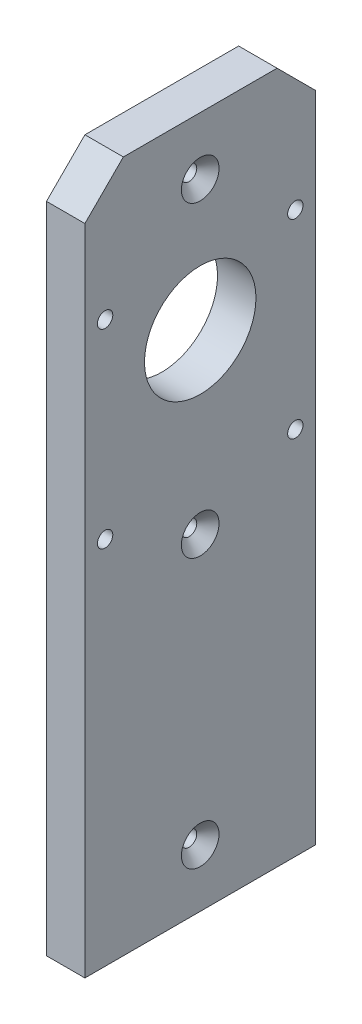
ISO-10303-21;
HEADER;
FILE_DESCRIPTION(('STEP AP214'),'2;1');
FILE_NAME('part.step','',(''),(''),'','','');
FILE_SCHEMA(('AUTOMOTIVE_DESIGN { 1 0 10303 214 1 1 1 1 }'));
ENDSEC;
DATA;
#1=APPLICATION_CONTEXT('core data for automotive mechanical design processes');
#2=APPLICATION_PROTOCOL_DEFINITION('international standard','automotive_design',2000,#1);
#3=PRODUCT_CONTEXT('',#1,'mechanical');
#4=PRODUCT('Part','Part','',(#3));
#5=PRODUCT_RELATED_PRODUCT_CATEGORY('part','',(#4));
#6=PRODUCT_DEFINITION_FORMATION('','',#4);
#7=PRODUCT_DEFINITION_CONTEXT('part definition',#1,'design');
#8=PRODUCT_DEFINITION('design','',#6,#7);
#9=PRODUCT_DEFINITION_SHAPE('','',#8);
#10=(LENGTH_UNIT() NAMED_UNIT(*) SI_UNIT(.MILLI.,.METRE.));
#11=(NAMED_UNIT(*) PLANE_ANGLE_UNIT() SI_UNIT($,.RADIAN.));
#12=(NAMED_UNIT(*) SI_UNIT($,.STERADIAN.) SOLID_ANGLE_UNIT());
#13=UNCERTAINTY_MEASURE_WITH_UNIT(LENGTH_MEASURE(1.E-05),#10,'distance_accuracy_value','');
#14=(GEOMETRIC_REPRESENTATION_CONTEXT(3) GLOBAL_UNCERTAINTY_ASSIGNED_CONTEXT((#13)) GLOBAL_UNIT_ASSIGNED_CONTEXT((#10,
#11,#12)) REPRESENTATION_CONTEXT('',''));
#15=CARTESIAN_POINT('',(0.,0.,0.));
#16=DIRECTION('',(0.,0.,1.));
#17=DIRECTION('',(1.,0.,0.));
#18=AXIS2_PLACEMENT_3D('',#15,#16,#17);
#19=CARTESIAN_POINT('',(10.,50.0624749276451,25.9036398419182));
#20=DIRECTION('',(0.,0.,-1.));
#21=DIRECTION('',(0.,1.,0.));
#22=AXIS2_PLACEMENT_3D('',#19,#20,#21);
#23=PLANE('',#22);
#24=DIRECTION('',(0.,-1.,0.));
#25=VECTOR('',#24,1.);
#26=CARTESIAN_POINT('',(10.,50.0624749276451,25.9036398419182));
#27=LINE('',#26,#25);
#28=CARTESIAN_POINT('',(10.,40.062474927645,25.9036398419182));
#29=VERTEX_POINT('',#28);
#30=CARTESIAN_POINT('',(10.,-129.937525072355,25.9036398419182));
#31=VERTEX_POINT('',#30);
#32=EDGE_CURVE('E86',#29,#31,#27,.T.);
#33=ORIENTED_EDGE('',*,*,#32,.F.);
#34=DIRECTION('',(-1.,0.,0.));
#35=VECTOR('',#34,1.);
#36=CARTESIAN_POINT('',(10.,40.062474927645,25.9036398419182));
#37=LINE('',#36,#35);
#38=CARTESIAN_POINT('',(0.,40.062474927645,25.9036398419182));
#39=VERTEX_POINT('',#38);
#40=EDGE_CURVE('E11',#29,#39,#37,.T.);
#41=ORIENTED_EDGE('',*,*,#40,.T.);
#42=DIRECTION('',(0.,-1.,0.));
#43=VECTOR('',#42,1.);
#44=CARTESIAN_POINT('',(0.,50.0624749276451,25.9036398419182));
#45=LINE('',#44,#43);
#46=CARTESIAN_POINT('',(0.,-129.937525072355,25.9036398419182));
#47=VERTEX_POINT('',#46);
#48=EDGE_CURVE('E105',#39,#47,#45,.T.);
#49=ORIENTED_EDGE('',*,*,#48,.T.);
#50=DIRECTION('',(-1.,0.,0.));
#51=VECTOR('',#50,1.);
#52=CARTESIAN_POINT('',(10.,-129.937525072355,25.9036398419182));
#53=LINE('',#52,#51);
#54=EDGE_CURVE('E99',#31,#47,#53,.T.);
#55=ORIENTED_EDGE('',*,*,#54,.F.);
#56=EDGE_LOOP('',(#33,#41,#49,#55));
#57=FACE_BOUND('',#56,.T.);
#58=ADVANCED_FACE('F33',(#57),#23,.F.);
#59=CARTESIAN_POINT('',(10.,-129.937525072355,25.9036398419182));
#60=DIRECTION('',(0.,1.,0.));
#61=DIRECTION('',(0.,0.,1.));
#62=AXIS2_PLACEMENT_3D('',#59,#60,#61);
#63=PLANE('',#62);
#64=CARTESIAN_POINT('',(5.00000000000001,-129.937525072355,-28.0963601580818));
#65=DIRECTION('',(0.,-1.,0.));
#66=DIRECTION('',(0.,0.,-1.));
#67=AXIS2_PLACEMENT_3D('',#64,#65,#66);
#68=CIRCLE('',#67,1.65);
#69=CARTESIAN_POINT('',(5.00000000000001,-129.937525072355,-29.7463601580818));
#70=VERTEX_POINT('',#69);
#71=EDGE_CURVE('E220',#70,#70,#68,.T.);
#72=ORIENTED_EDGE('',*,*,#71,.F.);
#73=EDGE_LOOP('',(#72));
#74=FACE_BOUND('',#73,.T.);
#75=CARTESIAN_POINT('',(5.,-129.937525072355,19.9036398419183));
#76=DIRECTION('',(0.,-1.,0.));
#77=DIRECTION('',(0.,0.,-1.));
#78=AXIS2_PLACEMENT_3D('',#75,#76,#77);
#79=CIRCLE('',#78,1.65);
#80=CARTESIAN_POINT('',(5.,-129.937525072355,18.2536398419183));
#81=VERTEX_POINT('',#80);
#82=EDGE_CURVE('E214',#81,#81,#79,.T.);
#83=ORIENTED_EDGE('',*,*,#82,.F.);
#84=EDGE_LOOP('',(#83));
#85=FACE_BOUND('',#84,.T.);
#86=DIRECTION('',(0.,0.,-1.));
#87=VECTOR('',#86,1.);
#88=CARTESIAN_POINT('',(0.,-129.937525072355,25.9036398419182));
#89=LINE('',#88,#87);
#90=CARTESIAN_POINT('',(0.,-129.937525072355,-34.0963601580818));
#91=VERTEX_POINT('',#90);
#92=EDGE_CURVE('E191',#47,#91,#89,.T.);
#93=ORIENTED_EDGE('',*,*,#92,.T.);
#94=DIRECTION('',(-1.,0.,0.));
#95=VECTOR('',#94,1.);
#96=CARTESIAN_POINT('',(10.,-129.937525072355,-34.0963601580818));
#97=LINE('',#96,#95);
#98=CARTESIAN_POINT('',(10.,-129.937525072355,-34.0963601580818));
#99=VERTEX_POINT('',#98);
#100=EDGE_CURVE('E101',#99,#91,#97,.T.);
#101=ORIENTED_EDGE('',*,*,#100,.F.);
#102=DIRECTION('',(0.,0.,-1.));
#103=VECTOR('',#102,1.);
#104=CARTESIAN_POINT('',(10.,-129.937525072355,25.9036398419182));
#105=LINE('',#104,#103);
#106=EDGE_CURVE('E89',#31,#99,#105,.T.);
#107=ORIENTED_EDGE('',*,*,#106,.F.);
#108=ORIENTED_EDGE('',*,*,#54,.T.);
#109=EDGE_LOOP('',(#93,#101,#107,#108));
#110=FACE_BOUND('',#109,.T.);
#111=ADVANCED_FACE('F98',(#74,#85,#110),#63,.F.);
#112=CARTESIAN_POINT('',(10.,50.0624749276451,-34.0963601580818));
#113=DIRECTION('',(0.,0.,1.));
#114=DIRECTION('',(0.,-1.,0.));
#115=AXIS2_PLACEMENT_3D('',#112,#113,#114);
#116=PLANE('',#115);
#117=DIRECTION('',(0.,1.,0.));
#118=VECTOR('',#117,1.);
#119=CARTESIAN_POINT('',(0.,50.0624749276451,-34.0963601580818));
#120=LINE('',#119,#118);
#121=CARTESIAN_POINT('',(0.,40.062474927645,-34.0963601580818));
#122=VERTEX_POINT('',#121);
#123=EDGE_CURVE('E189',#91,#122,#120,.T.);
#124=ORIENTED_EDGE('',*,*,#123,.T.);
#125=DIRECTION('',(1.,0.,0.));
#126=VECTOR('',#125,1.);
#127=CARTESIAN_POINT('',(10.,40.062474927645,-34.0963601580818));
#128=LINE('',#127,#126);
#129=CARTESIAN_POINT('',(10.,40.062474927645,-34.0963601580818));
#130=VERTEX_POINT('',#129);
#131=EDGE_CURVE('E56',#122,#130,#128,.T.);
#132=ORIENTED_EDGE('',*,*,#131,.T.);
#133=DIRECTION('',(0.,1.,0.));
#134=VECTOR('',#133,1.);
#135=CARTESIAN_POINT('',(10.,50.0624749276451,-34.0963601580818));
#136=LINE('',#135,#134);
#137=EDGE_CURVE('E102',#99,#130,#136,.T.);
#138=ORIENTED_EDGE('',*,*,#137,.F.);
#139=ORIENTED_EDGE('',*,*,#100,.T.);
#140=EDGE_LOOP('',(#124,#132,#138,#139));
#141=FACE_BOUND('',#140,.T.);
#142=ADVANCED_FACE('F190',(#141),#116,.F.);
#143=CARTESIAN_POINT('',(10.,50.0624749276451,25.9036398419182));
#144=DIRECTION('',(0.,-1.,0.));
#145=DIRECTION('',(0.,0.,-1.));
#146=AXIS2_PLACEMENT_3D('',#143,#144,#145);
#147=PLANE('',#146);
#148=DIRECTION('',(0.,0.,1.));
#149=VECTOR('',#148,1.);
#150=CARTESIAN_POINT('',(10.,50.0624749276451,25.9036398419182));
#151=LINE('',#150,#149);
#152=CARTESIAN_POINT('',(10.,50.0624749276451,-24.0963601580817));
#153=VERTEX_POINT('',#152);
#154=CARTESIAN_POINT('',(10.,50.0624749276451,15.9036398419182));
#155=VERTEX_POINT('',#154);
#156=EDGE_CURVE('E112',#153,#155,#151,.T.);
#157=ORIENTED_EDGE('',*,*,#156,.F.);
#158=DIRECTION('',(-1.,0.,0.));
#159=VECTOR('',#158,1.);
#160=CARTESIAN_POINT('',(10.,50.0624749276451,-24.0963601580817));
#161=LINE('',#160,#159);
#162=CARTESIAN_POINT('',(0.,50.0624749276451,-24.0963601580817));
#163=VERTEX_POINT('',#162);
#164=EDGE_CURVE('E167',#153,#163,#161,.T.);
#165=ORIENTED_EDGE('',*,*,#164,.T.);
#166=DIRECTION('',(0.,0.,1.));
#167=VECTOR('',#166,1.);
#168=CARTESIAN_POINT('',(0.,50.0624749276451,25.9036398419182));
#169=LINE('',#168,#167);
#170=CARTESIAN_POINT('',(0.,50.0624749276451,15.9036398419182));
#171=VERTEX_POINT('',#170);
#172=EDGE_CURVE('E94',#163,#171,#169,.T.);
#173=ORIENTED_EDGE('',*,*,#172,.T.);
#174=DIRECTION('',(1.,0.,0.));
#175=VECTOR('',#174,1.);
#176=CARTESIAN_POINT('',(10.,50.0624749276451,15.9036398419182));
#177=LINE('',#176,#175);
#178=EDGE_CURVE('E165',#171,#155,#177,.T.);
#179=ORIENTED_EDGE('',*,*,#178,.T.);
#180=EDGE_LOOP('',(#157,#165,#173,#179));
#181=FACE_BOUND('',#180,.T.);
#182=ADVANCED_FACE('F180',(#181),#147,.F.);
#183=CARTESIAN_POINT('',(10.,0.,0.));
#184=DIRECTION('',(1.,0.,0.));
#185=DIRECTION('',(0.,0.,-1.));
#186=AXIS2_PLACEMENT_3D('',#183,#184,#185);
#187=PLANE('',#186);
#188=CARTESIAN_POINT('',(10.,35.0624749276451,-4.09636015808176));
#189=DIRECTION('',(1.,0.,0.));
#190=DIRECTION('',(0.,0.,-1.));
#191=AXIS2_PLACEMENT_3D('',#188,#189,#190);
#192=CIRCLE('',#191,4.90000000000007);
#193=CARTESIAN_POINT('',(10.,35.0624749276451,-8.99636015808183));
#194=VERTEX_POINT('',#193);
#195=EDGE_CURVE('E156',#194,#194,#192,.F.);
#196=ORIENTED_EDGE('',*,*,#195,.T.);
#197=EDGE_LOOP('',(#196));
#198=FACE_BOUND('',#197,.T.);
#199=CARTESIAN_POINT('',(10.,-44.9375250723549,-4.09636015808177));
#200=DIRECTION('',(1.,0.,0.));
#201=DIRECTION('',(0.,0.,-1.));
#202=AXIS2_PLACEMENT_3D('',#199,#200,#201);
#203=CIRCLE('',#202,4.90000000000007);
#204=CARTESIAN_POINT('',(10.,-44.9375250723549,-8.99636015808184));
#205=VERTEX_POINT('',#204);
#206=EDGE_CURVE('E153',#205,#205,#203,.F.);
#207=ORIENTED_EDGE('',*,*,#206,.T.);
#208=EDGE_LOOP('',(#207));
#209=FACE_BOUND('',#208,.T.);
#210=CARTESIAN_POINT('',(10.,-114.937525072355,-4.09636015808178));
#211=DIRECTION('',(1.,0.,0.));
#212=DIRECTION('',(0.,0.,-1.));
#213=AXIS2_PLACEMENT_3D('',#210,#211,#212);
#214=CIRCLE('',#213,4.90000000000007);
#215=CARTESIAN_POINT('',(10.,-114.937525072355,-8.99636015808185));
#216=VERTEX_POINT('',#215);
#217=EDGE_CURVE('E150',#216,#216,#214,.F.);
#218=ORIENTED_EDGE('',*,*,#217,.T.);
#219=EDGE_LOOP('',(#218));
#220=FACE_BOUND('',#219,.T.);
#221=CARTESIAN_POINT('',(10.,-33.6862624138838,20.6523771834499));
#222=DIRECTION('',(-1.,0.,0.));
#223=DIRECTION('',(0.,0.,1.));
#224=AXIS2_PLACEMENT_3D('',#221,#222,#223);
#225=CIRCLE('',#224,1.99999999999848);
#226=CARTESIAN_POINT('',(10.,-33.6862624138838,22.6523771834483));
#227=VERTEX_POINT('',#226);
#228=EDGE_CURVE('E140',#227,#227,#225,.T.);
#229=ORIENTED_EDGE('',*,*,#228,.T.);
#230=EDGE_LOOP('',(#229));
#231=FACE_BOUND('',#230,.T.);
#232=CARTESIAN_POINT('',(10.,15.8112122691745,20.6523771834498));
#233=DIRECTION('',(-1.,0.,0.));
#234=DIRECTION('',(0.,0.,1.));
#235=AXIS2_PLACEMENT_3D('',#232,#233,#234);
#236=CIRCLE('',#235,1.99999999999852);
#237=CARTESIAN_POINT('',(10.,15.8112122691745,22.6523771834483));
#238=VERTEX_POINT('',#237);
#239=EDGE_CURVE('E209',#238,#238,#236,.T.);
#240=ORIENTED_EDGE('',*,*,#239,.T.);
#241=EDGE_LOOP('',(#240));
#242=FACE_BOUND('',#241,.T.);
#243=CARTESIAN_POINT('',(10.,-33.6862624138839,-28.8450974996085));
#244=DIRECTION('',(-1.,0.,0.));
#245=DIRECTION('',(0.,0.,1.));
#246=AXIS2_PLACEMENT_3D('',#243,#244,#245);
#247=CIRCLE('',#246,1.99999999999847);
#248=CARTESIAN_POINT('',(10.,-33.6862624138839,-26.84509749961));
#249=VERTEX_POINT('',#248);
#250=EDGE_CURVE('E206',#249,#249,#247,.T.);
#251=ORIENTED_EDGE('',*,*,#250,.T.);
#252=EDGE_LOOP('',(#251));
#253=FACE_BOUND('',#252,.T.);
#254=CARTESIAN_POINT('',(10.,15.8112122691745,-28.8450974996085));
#255=DIRECTION('',(-1.,0.,0.));
#256=DIRECTION('',(0.,0.,1.));
#257=AXIS2_PLACEMENT_3D('',#254,#255,#256);
#258=CIRCLE('',#257,1.99999999999851);
#259=CARTESIAN_POINT('',(10.,15.8112122691745,-26.84509749961));
#260=VERTEX_POINT('',#259);
#261=EDGE_CURVE('E203',#260,#260,#258,.T.);
#262=ORIENTED_EDGE('',*,*,#261,.T.);
#263=EDGE_LOOP('',(#262));
#264=FACE_BOUND('',#263,.T.);
#265=CARTESIAN_POINT('',(10.,1.06247492764533,-4.09636015807933));
#266=DIRECTION('',(1.,0.,0.));
#267=DIRECTION('',(0.,0.,-1.));
#268=AXIS2_PLACEMENT_3D('',#265,#266,#267);
#269=CIRCLE('',#268,14.4999999999766);
#270=CARTESIAN_POINT('',(10.,1.06247492764533,-18.5963601580559));
#271=VERTEX_POINT('',#270);
#272=EDGE_CURVE('E195',#271,#271,#269,.T.);
#273=ORIENTED_EDGE('',*,*,#272,.F.);
#274=EDGE_LOOP('',(#273));
#275=FACE_BOUND('',#274,.T.);
#276=ORIENTED_EDGE('',*,*,#137,.T.);
#277=DIRECTION('',(0.,-0.707106781186549,-0.707106781186547));
#278=VECTOR('',#277,1.);
#279=CARTESIAN_POINT('',(10.,37.0794175428633,-37.0794175428634));
#280=LINE('',#279,#278);
#281=EDGE_CURVE('E41',#130,#153,#280,.F.);
#282=ORIENTED_EDGE('',*,*,#281,.T.);
#283=ORIENTED_EDGE('',*,*,#156,.T.);
#284=DIRECTION('',(0.,0.707106781186547,-0.707106781186549));
#285=VECTOR('',#284,1.);
#286=CARTESIAN_POINT('',(10.,32.9830573847817,32.9830573847816));
#287=LINE('',#286,#285);
#288=EDGE_CURVE('E48',#155,#29,#287,.F.);
#289=ORIENTED_EDGE('',*,*,#288,.T.);
#290=ORIENTED_EDGE('',*,*,#32,.T.);
#291=ORIENTED_EDGE('',*,*,#106,.T.);
#292=EDGE_LOOP('',(#276,#282,#283,#289,#290,#291));
#293=FACE_BOUND('',#292,.T.);
#294=ADVANCED_FACE('F88',(#198,#209,#220,#231,#242,#253,#264,#275,#293),#187,.T.);
#295=CARTESIAN_POINT('',(0.,0.,0.));
#296=DIRECTION('',(1.,0.,0.));
#297=DIRECTION('',(0.,0.,-1.));
#298=AXIS2_PLACEMENT_3D('',#295,#296,#297);
#299=PLANE('',#298);
#300=CARTESIAN_POINT('',(0.,35.0624749276451,-4.09636015808176));
#301=DIRECTION('',(1.,0.,0.));
#302=DIRECTION('',(0.,0.,-1.));
#303=AXIS2_PLACEMENT_3D('',#300,#301,#302);
#304=CIRCLE('',#303,2.);
#305=CARTESIAN_POINT('',(0.,35.0624749276451,-6.09636015808176));
#306=VERTEX_POINT('',#305);
#307=EDGE_CURVE('E144',#306,#306,#304,.T.);
#308=ORIENTED_EDGE('',*,*,#307,.T.);
#309=EDGE_LOOP('',(#308));
#310=FACE_BOUND('',#309,.T.);
#311=CARTESIAN_POINT('',(0.,-44.9375250723549,-4.09636015808177));
#312=DIRECTION('',(1.,0.,0.));
#313=DIRECTION('',(0.,0.,-1.));
#314=AXIS2_PLACEMENT_3D('',#311,#312,#313);
#315=CIRCLE('',#314,2.);
#316=CARTESIAN_POINT('',(0.,-44.9375250723549,-6.09636015808177));
#317=VERTEX_POINT('',#316);
#318=EDGE_CURVE('E141',#317,#317,#315,.T.);
#319=ORIENTED_EDGE('',*,*,#318,.T.);
#320=EDGE_LOOP('',(#319));
#321=FACE_BOUND('',#320,.T.);
#322=CARTESIAN_POINT('',(0.,-114.937525072355,-4.09636015808178));
#323=DIRECTION('',(1.,0.,0.));
#324=DIRECTION('',(0.,0.,-1.));
#325=AXIS2_PLACEMENT_3D('',#322,#323,#324);
#326=CIRCLE('',#325,2.);
#327=CARTESIAN_POINT('',(0.,-114.937525072355,-6.09636015808178));
#328=VERTEX_POINT('',#327);
#329=EDGE_CURVE('E137',#328,#328,#326,.T.);
#330=ORIENTED_EDGE('',*,*,#329,.T.);
#331=EDGE_LOOP('',(#330));
#332=FACE_BOUND('',#331,.T.);
#333=CARTESIAN_POINT('',(0.,15.8112122691745,20.6523771834498));
#334=DIRECTION('',(1.,0.,0.));
#335=DIRECTION('',(0.,0.,-1.));
#336=AXIS2_PLACEMENT_3D('',#333,#334,#335);
#337=CIRCLE('',#336,3.9999999999985);
#338=CARTESIAN_POINT('',(0.,15.8112122691745,16.6523771834513));
#339=VERTEX_POINT('',#338);
#340=EDGE_CURVE('E124',#339,#339,#337,.T.);
#341=ORIENTED_EDGE('',*,*,#340,.T.);
#342=EDGE_LOOP('',(#341));
#343=FACE_BOUND('',#342,.T.);
#344=CARTESIAN_POINT('',(0.,-33.6862624138838,20.6523771834499));
#345=DIRECTION('',(1.,0.,0.));
#346=DIRECTION('',(0.,0.,-1.));
#347=AXIS2_PLACEMENT_3D('',#344,#345,#346);
#348=CIRCLE('',#347,3.9999999999985);
#349=CARTESIAN_POINT('',(0.,-33.6862624138838,16.6523771834514));
#350=VERTEX_POINT('',#349);
#351=EDGE_CURVE('E121',#350,#350,#348,.T.);
#352=ORIENTED_EDGE('',*,*,#351,.T.);
#353=EDGE_LOOP('',(#352));
#354=FACE_BOUND('',#353,.T.);
#355=CARTESIAN_POINT('',(0.,-33.6862624138839,-28.8450974996085));
#356=DIRECTION('',(1.,0.,0.));
#357=DIRECTION('',(0.,0.,-1.));
#358=AXIS2_PLACEMENT_3D('',#355,#356,#357);
#359=CIRCLE('',#358,3.9999999999985);
#360=CARTESIAN_POINT('',(0.,-33.6862624138839,-32.845097499607));
#361=VERTEX_POINT('',#360);
#362=EDGE_CURVE('E118',#361,#361,#359,.T.);
#363=ORIENTED_EDGE('',*,*,#362,.T.);
#364=EDGE_LOOP('',(#363));
#365=FACE_BOUND('',#364,.T.);
#366=CARTESIAN_POINT('',(0.,15.8112122691745,-28.8450974996085));
#367=DIRECTION('',(1.,0.,0.));
#368=DIRECTION('',(0.,0.,-1.));
#369=AXIS2_PLACEMENT_3D('',#366,#367,#368);
#370=CIRCLE('',#369,3.9999999999985);
#371=CARTESIAN_POINT('',(0.,15.8112122691745,-32.845097499607));
#372=VERTEX_POINT('',#371);
#373=EDGE_CURVE('E110',#372,#372,#370,.T.);
#374=ORIENTED_EDGE('',*,*,#373,.T.);
#375=EDGE_LOOP('',(#374));
#376=FACE_BOUND('',#375,.T.);
#377=CARTESIAN_POINT('',(0.,1.06247492764533,-4.09636015807933));
#378=DIRECTION('',(-1.,0.,0.));
#379=DIRECTION('',(0.,0.,1.));
#380=AXIS2_PLACEMENT_3D('',#377,#378,#379);
#381=CIRCLE('',#380,14.4999999999766);
#382=CARTESIAN_POINT('',(0.,1.06247492764533,10.4036398418972));
#383=VERTEX_POINT('',#382);
#384=EDGE_CURVE('E200',#383,#383,#381,.T.);
#385=ORIENTED_EDGE('',*,*,#384,.F.);
#386=EDGE_LOOP('',(#385));
#387=FACE_BOUND('',#386,.T.);
#388=ORIENTED_EDGE('',*,*,#172,.F.);
#389=DIRECTION('',(0.,0.707106781186549,0.707106781186547));
#390=VECTOR('',#389,1.);
#391=CARTESIAN_POINT('',(0.,50.0624749276451,-24.0963601580817));
#392=LINE('',#391,#390);
#393=EDGE_CURVE('E172',#163,#122,#392,.F.);
#394=ORIENTED_EDGE('',*,*,#393,.T.);
#395=ORIENTED_EDGE('',*,*,#123,.F.);
#396=ORIENTED_EDGE('',*,*,#92,.F.);
#397=ORIENTED_EDGE('',*,*,#48,.F.);
#398=DIRECTION('',(0.,-0.707106781186547,0.707106781186549));
#399=VECTOR('',#398,1.);
#400=CARTESIAN_POINT('',(0.,40.062474927645,25.9036398419182));
#401=LINE('',#400,#399);
#402=EDGE_CURVE('E170',#39,#171,#401,.F.);
#403=ORIENTED_EDGE('',*,*,#402,.T.);
#404=EDGE_LOOP('',(#388,#394,#395,#396,#397,#403));
#405=FACE_BOUND('',#404,.T.);
#406=ADVANCED_FACE('F188',(#310,#321,#332,#343,#354,#365,#376,#387,#405),#299,.F.);
#407=CARTESIAN_POINT('',(30.,1.06247492764533,-4.09636015807933));
#408=DIRECTION('',(-1.,0.,0.));
#409=DIRECTION('',(0.,0.,1.));
#410=AXIS2_PLACEMENT_3D('',#407,#408,#409);
#411=CYLINDRICAL_SURFACE('',#410,14.4999999999766);
#412=ORIENTED_EDGE('',*,*,#272,.T.);
#413=EDGE_LOOP('',(#412));
#414=FACE_BOUND('',#413,.T.);
#415=ORIENTED_EDGE('',*,*,#384,.T.);
#416=EDGE_LOOP('',(#415));
#417=FACE_BOUND('',#416,.T.);
#418=ADVANCED_FACE('F355',(#414,#417),#411,.F.);
#419=CARTESIAN_POINT('',(10.,15.8112122691745,-28.8450974996085));
#420=DIRECTION('',(-1.,0.,0.));
#421=DIRECTION('',(0.,0.,1.));
#422=AXIS2_PLACEMENT_3D('',#419,#420,#421);
#423=CYLINDRICAL_SURFACE('',#422,1.99999999999851);
#424=CARTESIAN_POINT('',(1.99999999999997,15.8112122691745,-28.8450974996085));
#425=DIRECTION('',(1.,0.,0.));
#426=DIRECTION('',(0.,0.,-1.));
#427=AXIS2_PLACEMENT_3D('',#424,#425,#426);
#428=CIRCLE('',#427,1.99999999999851);
#429=CARTESIAN_POINT('',(1.99999999999997,15.8112122691745,-30.845097499607));
#430=VERTEX_POINT('',#429);
#431=EDGE_CURVE('E133',#430,#430,#428,.F.);
#432=ORIENTED_EDGE('',*,*,#431,.T.);
#433=EDGE_LOOP('',(#432));
#434=FACE_BOUND('',#433,.T.);
#435=ORIENTED_EDGE('',*,*,#261,.F.);
#436=EDGE_LOOP('',(#435));
#437=FACE_BOUND('',#436,.T.);
#438=ADVANCED_FACE('F363',(#434,#437),#423,.F.);
#439=CARTESIAN_POINT('',(10.,-33.6862624138839,-28.8450974996085));
#440=DIRECTION('',(-1.,0.,0.));
#441=DIRECTION('',(0.,0.,1.));
#442=AXIS2_PLACEMENT_3D('',#439,#440,#441);
#443=CYLINDRICAL_SURFACE('',#442,1.99999999999847);
#444=CARTESIAN_POINT('',(2.00000000000001,-33.6862624138839,-28.8450974996085));
#445=DIRECTION('',(1.,0.,0.));
#446=DIRECTION('',(0.,0.,-1.));
#447=AXIS2_PLACEMENT_3D('',#444,#445,#446);
#448=CIRCLE('',#447,1.99999999999847);
#449=CARTESIAN_POINT('',(2.00000000000001,-33.6862624138839,-30.8450974996069));
#450=VERTEX_POINT('',#449);
#451=EDGE_CURVE('E130',#450,#450,#448,.F.);
#452=ORIENTED_EDGE('',*,*,#451,.T.);
#453=EDGE_LOOP('',(#452));
#454=FACE_BOUND('',#453,.T.);
#455=ORIENTED_EDGE('',*,*,#250,.F.);
#456=EDGE_LOOP('',(#455));
#457=FACE_BOUND('',#456,.T.);
#458=ADVANCED_FACE('F371',(#454,#457),#443,.F.);
#459=CARTESIAN_POINT('',(10.,15.8112122691745,20.6523771834498));
#460=DIRECTION('',(-1.,0.,0.));
#461=DIRECTION('',(0.,0.,1.));
#462=AXIS2_PLACEMENT_3D('',#459,#460,#461);
#463=CYLINDRICAL_SURFACE('',#462,1.99999999999852);
#464=CARTESIAN_POINT('',(1.99999999999997,15.8112122691745,20.6523771834498));
#465=DIRECTION('',(1.,0.,0.));
#466=DIRECTION('',(0.,0.,-1.));
#467=AXIS2_PLACEMENT_3D('',#464,#465,#466);
#468=CIRCLE('',#467,1.99999999999852);
#469=CARTESIAN_POINT('',(1.99999999999997,15.8112122691745,18.6523771834513));
#470=VERTEX_POINT('',#469);
#471=EDGE_CURVE('E107',#470,#470,#468,.F.);
#472=ORIENTED_EDGE('',*,*,#471,.T.);
#473=EDGE_LOOP('',(#472));
#474=FACE_BOUND('',#473,.T.);
#475=ORIENTED_EDGE('',*,*,#239,.F.);
#476=EDGE_LOOP('',(#475));
#477=FACE_BOUND('',#476,.T.);
#478=ADVANCED_FACE('F379',(#474,#477),#463,.F.);
#479=CARTESIAN_POINT('',(10.,-33.6862624138838,20.6523771834499));
#480=DIRECTION('',(-1.,0.,0.));
#481=DIRECTION('',(0.,0.,1.));
#482=AXIS2_PLACEMENT_3D('',#479,#480,#481);
#483=CYLINDRICAL_SURFACE('',#482,1.99999999999848);
#484=CARTESIAN_POINT('',(2.00000000000001,-33.6862624138838,20.6523771834499));
#485=DIRECTION('',(1.,0.,0.));
#486=DIRECTION('',(0.,0.,-1.));
#487=AXIS2_PLACEMENT_3D('',#484,#485,#486);
#488=CIRCLE('',#487,1.99999999999848);
#489=CARTESIAN_POINT('',(2.00000000000001,-33.6862624138838,18.6523771834514));
#490=VERTEX_POINT('',#489);
#491=EDGE_CURVE('E127',#490,#490,#488,.F.);
#492=ORIENTED_EDGE('',*,*,#491,.T.);
#493=EDGE_LOOP('',(#492));
#494=FACE_BOUND('',#493,.T.);
#495=ORIENTED_EDGE('',*,*,#228,.F.);
#496=EDGE_LOOP('',(#495));
#497=FACE_BOUND('',#496,.T.);
#498=ADVANCED_FACE('F263',(#494,#497),#483,.F.);
#499=CARTESIAN_POINT('',(1.99999999999997,15.8112122691745,20.6523771834498));
#500=DIRECTION('',(-1.,0.,0.));
#501=DIRECTION('',(0.,0.,1.));
#502=AXIS2_PLACEMENT_3D('',#499,#500,#501);
#503=CONICAL_SURFACE('',#502,1.99999999999852,0.785398163397453);
#504=ORIENTED_EDGE('',*,*,#340,.F.);
#505=EDGE_LOOP('',(#504));
#506=FACE_BOUND('',#505,.T.);
#507=ORIENTED_EDGE('',*,*,#471,.F.);
#508=EDGE_LOOP('',(#507));
#509=FACE_BOUND('',#508,.T.);
#510=ADVANCED_FACE('F259',(#506,#509),#503,.F.);
#511=CARTESIAN_POINT('',(2.00000000000001,-33.6862624138838,20.6523771834499));
#512=DIRECTION('',(-1.,0.,0.));
#513=DIRECTION('',(0.,0.,1.));
#514=AXIS2_PLACEMENT_3D('',#511,#512,#513);
#515=CONICAL_SURFACE('',#514,1.99999999999848,0.785398163397453);
#516=ORIENTED_EDGE('',*,*,#351,.F.);
#517=EDGE_LOOP('',(#516));
#518=FACE_BOUND('',#517,.T.);
#519=ORIENTED_EDGE('',*,*,#491,.F.);
#520=EDGE_LOOP('',(#519));
#521=FACE_BOUND('',#520,.T.);
#522=ADVANCED_FACE('F262',(#518,#521),#515,.F.);
#523=CARTESIAN_POINT('',(2.00000000000001,-33.6862624138839,-28.8450974996085));
#524=DIRECTION('',(-1.,0.,0.));
#525=DIRECTION('',(0.,0.,1.));
#526=AXIS2_PLACEMENT_3D('',#523,#524,#525);
#527=CONICAL_SURFACE('',#526,1.99999999999847,0.785398163397454);
#528=ORIENTED_EDGE('',*,*,#362,.F.);
#529=EDGE_LOOP('',(#528));
#530=FACE_BOUND('',#529,.T.);
#531=ORIENTED_EDGE('',*,*,#451,.F.);
#532=EDGE_LOOP('',(#531));
#533=FACE_BOUND('',#532,.T.);
#534=ADVANCED_FACE('F267',(#530,#533),#527,.F.);
#535=CARTESIAN_POINT('',(1.99999999999997,15.8112122691745,-28.8450974996085));
#536=DIRECTION('',(-1.,0.,0.));
#537=DIRECTION('',(0.,0.,1.));
#538=AXIS2_PLACEMENT_3D('',#535,#536,#537);
#539=CONICAL_SURFACE('',#538,1.99999999999851,0.785398163397454);
#540=ORIENTED_EDGE('',*,*,#373,.F.);
#541=EDGE_LOOP('',(#540));
#542=FACE_BOUND('',#541,.T.);
#543=ORIENTED_EDGE('',*,*,#431,.F.);
#544=EDGE_LOOP('',(#543));
#545=FACE_BOUND('',#544,.T.);
#546=ADVANCED_FACE('F271',(#542,#545),#539,.F.);
#547=CARTESIAN_POINT('',(-5.,-114.937525072355,-4.09636015808178));
#548=DIRECTION('',(1.,0.,0.));
#549=DIRECTION('',(0.,0.,-1.));
#550=AXIS2_PLACEMENT_3D('',#547,#548,#549);
#551=CYLINDRICAL_SURFACE('',#550,2.);
#552=CARTESIAN_POINT('',(7.09999999999995,-114.937525072355,-4.09636015808178));
#553=DIRECTION('',(1.,0.,0.));
#554=DIRECTION('',(0.,0.,-1.));
#555=AXIS2_PLACEMENT_3D('',#552,#553,#554);
#556=CIRCLE('',#555,2.);
#557=CARTESIAN_POINT('',(7.09999999999995,-114.937525072355,-6.09636015808178));
#558=VERTEX_POINT('',#557);
#559=EDGE_CURVE('E162',#558,#558,#556,.T.);
#560=ORIENTED_EDGE('',*,*,#559,.T.);
#561=EDGE_LOOP('',(#560));
#562=FACE_BOUND('',#561,.T.);
#563=ORIENTED_EDGE('',*,*,#329,.F.);
#564=EDGE_LOOP('',(#563));
#565=FACE_BOUND('',#564,.T.);
#566=ADVANCED_FACE('F275',(#562,#565),#551,.F.);
#567=CARTESIAN_POINT('',(-5.,-44.9375250723549,-4.09636015808177));
#568=DIRECTION('',(1.,0.,0.));
#569=DIRECTION('',(0.,0.,-1.));
#570=AXIS2_PLACEMENT_3D('',#567,#568,#569);
#571=CYLINDRICAL_SURFACE('',#570,2.);
#572=CARTESIAN_POINT('',(7.09999999999995,-44.9375250723549,-4.09636015808177));
#573=DIRECTION('',(1.,0.,0.));
#574=DIRECTION('',(0.,0.,-1.));
#575=AXIS2_PLACEMENT_3D('',#572,#573,#574);
#576=CIRCLE('',#575,2.);
#577=CARTESIAN_POINT('',(7.09999999999995,-44.9375250723549,-6.09636015808177));
#578=VERTEX_POINT('',#577);
#579=EDGE_CURVE('E159',#578,#578,#576,.T.);
#580=ORIENTED_EDGE('',*,*,#579,.T.);
#581=EDGE_LOOP('',(#580));
#582=FACE_BOUND('',#581,.T.);
#583=ORIENTED_EDGE('',*,*,#318,.F.);
#584=EDGE_LOOP('',(#583));
#585=FACE_BOUND('',#584,.T.);
#586=ADVANCED_FACE('F417',(#582,#585),#571,.F.);
#587=CARTESIAN_POINT('',(-5.,35.0624749276451,-4.09636015808176));
#588=DIRECTION('',(1.,0.,0.));
#589=DIRECTION('',(0.,0.,-1.));
#590=AXIS2_PLACEMENT_3D('',#587,#588,#589);
#591=CYLINDRICAL_SURFACE('',#590,2.);
#592=CARTESIAN_POINT('',(7.09999999999995,35.0624749276451,-4.09636015808176));
#593=DIRECTION('',(1.,0.,0.));
#594=DIRECTION('',(0.,0.,-1.));
#595=AXIS2_PLACEMENT_3D('',#592,#593,#594);
#596=CIRCLE('',#595,2.);
#597=CARTESIAN_POINT('',(7.09999999999995,35.0624749276451,-6.09636015808176));
#598=VERTEX_POINT('',#597);
#599=EDGE_CURVE('E136',#598,#598,#596,.T.);
#600=ORIENTED_EDGE('',*,*,#599,.T.);
#601=EDGE_LOOP('',(#600));
#602=FACE_BOUND('',#601,.T.);
#603=ORIENTED_EDGE('',*,*,#307,.F.);
#604=EDGE_LOOP('',(#603));
#605=FACE_BOUND('',#604,.T.);
#606=ADVANCED_FACE('F281',(#602,#605),#591,.F.);
#607=CARTESIAN_POINT('',(7.09999999999995,35.0624749276451,-4.09636015808176));
#608=DIRECTION('',(1.,0.,0.));
#609=DIRECTION('',(0.,0.,-1.));
#610=AXIS2_PLACEMENT_3D('',#607,#608,#609);
#611=CONICAL_SURFACE('',#610,2.,0.785398163397452);
#612=ORIENTED_EDGE('',*,*,#195,.F.);
#613=EDGE_LOOP('',(#612));
#614=FACE_BOUND('',#613,.T.);
#615=ORIENTED_EDGE('',*,*,#599,.F.);
#616=EDGE_LOOP('',(#615));
#617=FACE_BOUND('',#616,.T.);
#618=ADVANCED_FACE('F277',(#614,#617),#611,.F.);
#619=CARTESIAN_POINT('',(7.09999999999995,-44.9375250723549,-4.09636015808177));
#620=DIRECTION('',(1.,0.,0.));
#621=DIRECTION('',(0.,0.,-1.));
#622=AXIS2_PLACEMENT_3D('',#619,#620,#621);
#623=CONICAL_SURFACE('',#622,2.,0.785398163397452);
#624=ORIENTED_EDGE('',*,*,#206,.F.);
#625=EDGE_LOOP('',(#624));
#626=FACE_BOUND('',#625,.T.);
#627=ORIENTED_EDGE('',*,*,#579,.F.);
#628=EDGE_LOOP('',(#627));
#629=FACE_BOUND('',#628,.T.);
#630=ADVANCED_FACE('F280',(#626,#629),#623,.F.);
#631=CARTESIAN_POINT('',(7.09999999999995,-114.937525072355,-4.09636015808178));
#632=DIRECTION('',(1.,0.,0.));
#633=DIRECTION('',(0.,0.,-1.));
#634=AXIS2_PLACEMENT_3D('',#631,#632,#633);
#635=CONICAL_SURFACE('',#634,2.,0.785398163397452);
#636=ORIENTED_EDGE('',*,*,#217,.F.);
#637=EDGE_LOOP('',(#636));
#638=FACE_BOUND('',#637,.T.);
#639=ORIENTED_EDGE('',*,*,#559,.F.);
#640=EDGE_LOOP('',(#639));
#641=FACE_BOUND('',#640,.T.);
#642=ADVANCED_FACE('F285',(#638,#641),#635,.F.);
#643=CARTESIAN_POINT('',(10.,50.0624749276451,-24.0963601580817));
#644=DIRECTION('',(0.,-0.707106781186546,0.707106781186548));
#645=DIRECTION('',(-1.,0.,0.));
#646=AXIS2_PLACEMENT_3D('',#643,#644,#645);
#647=PLANE('',#646);
#648=ORIENTED_EDGE('',*,*,#281,.F.);
#649=ORIENTED_EDGE('',*,*,#131,.F.);
#650=ORIENTED_EDGE('',*,*,#393,.F.);
#651=ORIENTED_EDGE('',*,*,#164,.F.);
#652=EDGE_LOOP('',(#648,#649,#650,#651));
#653=FACE_BOUND('',#652,.T.);
#654=ADVANCED_FACE('F185',(#653),#647,.F.);
#655=CARTESIAN_POINT('',(10.,40.062474927645,25.9036398419182));
#656=DIRECTION('',(0.,-0.707106781186548,-0.707106781186546));
#657=DIRECTION('',(-1.,0.,0.));
#658=AXIS2_PLACEMENT_3D('',#655,#656,#657);
#659=PLANE('',#658);
#660=ORIENTED_EDGE('',*,*,#288,.F.);
#661=ORIENTED_EDGE('',*,*,#178,.F.);
#662=ORIENTED_EDGE('',*,*,#402,.F.);
#663=ORIENTED_EDGE('',*,*,#40,.F.);
#664=EDGE_LOOP('',(#660,#661,#662,#663));
#665=FACE_BOUND('',#664,.T.);
#666=ADVANCED_FACE('F35',(#665),#659,.F.);
#667=CARTESIAN_POINT('',(5.,-114.937525072355,19.9036398419183));
#668=DIRECTION('',(0.,-1.,0.));
#669=DIRECTION('',(0.,0.,-1.));
#670=AXIS2_PLACEMENT_3D('',#667,#668,#669);
#671=CYLINDRICAL_SURFACE('',#670,1.65);
#672=CARTESIAN_POINT('',(5.,-114.937525072355,19.9036398419183));
#673=DIRECTION('',(0.,-1.,0.));
#674=DIRECTION('',(0.,0.,-1.));
#675=AXIS2_PLACEMENT_3D('',#672,#673,#674);
#676=CIRCLE('',#675,1.65);
#677=CARTESIAN_POINT('',(5.,-114.937525072355,18.2536398419183));
#678=VERTEX_POINT('',#677);
#679=EDGE_CURVE('E147',#678,#678,#676,.T.);
#680=ORIENTED_EDGE('',*,*,#679,.F.);
#681=EDGE_LOOP('',(#680));
#682=FACE_BOUND('',#681,.T.);
#683=ORIENTED_EDGE('',*,*,#82,.T.);
#684=EDGE_LOOP('',(#683));
#685=FACE_BOUND('',#684,.T.);
#686=ADVANCED_FACE('F240',(#682,#685),#671,.F.);
#687=CARTESIAN_POINT('',(5.,-114.937525072355,19.9036398419183));
#688=DIRECTION('',(0.,-1.,0.));
#689=DIRECTION('',(0.,0.,-1.));
#690=AXIS2_PLACEMENT_3D('',#687,#688,#689);
#691=PLANE('',#690);
#692=ORIENTED_EDGE('',*,*,#679,.T.);
#693=EDGE_LOOP('',(#692));
#694=FACE_BOUND('',#693,.T.);
#695=ADVANCED_FACE('F231',(#694),#691,.T.);
#696=CARTESIAN_POINT('',(5.00000000000001,-114.937525072355,-28.0963601580818));
#697=DIRECTION('',(0.,-1.,0.));
#698=DIRECTION('',(0.,0.,-1.));
#699=AXIS2_PLACEMENT_3D('',#696,#697,#698);
#700=CYLINDRICAL_SURFACE('',#699,1.65);
#701=CARTESIAN_POINT('',(5.00000000000001,-114.937525072355,-28.0963601580818));
#702=DIRECTION('',(0.,-1.,0.));
#703=DIRECTION('',(0.,0.,-1.));
#704=AXIS2_PLACEMENT_3D('',#701,#702,#703);
#705=CIRCLE('',#704,1.65);
#706=CARTESIAN_POINT('',(5.00000000000001,-114.937525072355,-29.7463601580818));
#707=VERTEX_POINT('',#706);
#708=EDGE_CURVE('E217',#707,#707,#705,.T.);
#709=ORIENTED_EDGE('',*,*,#708,.F.);
#710=EDGE_LOOP('',(#709));
#711=FACE_BOUND('',#710,.T.);
#712=ORIENTED_EDGE('',*,*,#71,.T.);
#713=EDGE_LOOP('',(#712));
#714=FACE_BOUND('',#713,.T.);
#715=ADVANCED_FACE('F228',(#711,#714),#700,.F.);
#716=CARTESIAN_POINT('',(5.00000000000001,-114.937525072355,-28.0963601580818));
#717=DIRECTION('',(0.,-1.,0.));
#718=DIRECTION('',(0.,0.,-1.));
#719=AXIS2_PLACEMENT_3D('',#716,#717,#718);
#720=PLANE('',#719);
#721=ORIENTED_EDGE('',*,*,#708,.T.);
#722=EDGE_LOOP('',(#721));
#723=FACE_BOUND('',#722,.T.);
#724=ADVANCED_FACE('F226',(#723),#720,.T.);
#725=CLOSED_SHELL('',(#58,#111,#142,#182,#294,#406,#418,#438,#458,#478,#498,#510,#522,#534,#546,
#566,#586,#606,#618,#630,#642,#654,#666,#686,#695,#715,#724));
#726=MANIFOLD_SOLID_BREP('B2',#725);
#727=ADVANCED_BREP_SHAPE_REPRESENTATION('',(#18,#726),#14);
#728=SHAPE_DEFINITION_REPRESENTATION(#9,#727);
ENDSEC;
END-ISO-10303-21;
